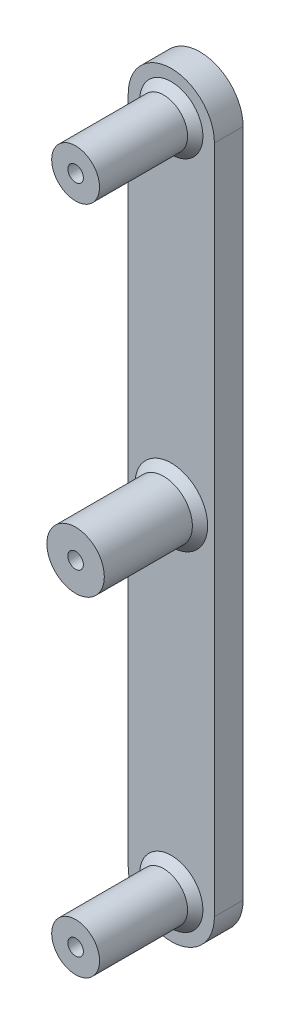
ISO-10303-21;
HEADER;
FILE_DESCRIPTION(('STEP AP214'),'2;1');
FILE_NAME('part.step','',(''),(''),'','','');
FILE_SCHEMA(('AUTOMOTIVE_DESIGN { 1 0 10303 214 1 1 1 1 }'));
ENDSEC;
DATA;
#1=APPLICATION_CONTEXT('core data for automotive mechanical design processes');
#2=APPLICATION_PROTOCOL_DEFINITION('international standard','automotive_design',2000,#1);
#3=PRODUCT_CONTEXT('',#1,'mechanical');
#4=PRODUCT('Part','Part','',(#3));
#5=PRODUCT_RELATED_PRODUCT_CATEGORY('part','',(#4));
#6=PRODUCT_DEFINITION_FORMATION('','',#4);
#7=PRODUCT_DEFINITION_CONTEXT('part definition',#1,'design');
#8=PRODUCT_DEFINITION('design','',#6,#7);
#9=PRODUCT_DEFINITION_SHAPE('','',#8);
#10=(LENGTH_UNIT() NAMED_UNIT(*) SI_UNIT(.MILLI.,.METRE.));
#11=(NAMED_UNIT(*) PLANE_ANGLE_UNIT() SI_UNIT($,.RADIAN.));
#12=(NAMED_UNIT(*) SI_UNIT($,.STERADIAN.) SOLID_ANGLE_UNIT());
#13=UNCERTAINTY_MEASURE_WITH_UNIT(LENGTH_MEASURE(1.E-05),#10,'distance_accuracy_value','');
#14=(GEOMETRIC_REPRESENTATION_CONTEXT(3) GLOBAL_UNCERTAINTY_ASSIGNED_CONTEXT((#13)) GLOBAL_UNIT_ASSIGNED_CONTEXT((#10,
#11,#12)) REPRESENTATION_CONTEXT('',''));
#15=CARTESIAN_POINT('',(0.,0.,0.));
#16=DIRECTION('',(0.,0.,1.));
#17=DIRECTION('',(1.,0.,0.));
#18=AXIS2_PLACEMENT_3D('',#15,#16,#17);
#19=CARTESIAN_POINT('',(0.,-35.,10.));
#20=DIRECTION('',(0.,0.,-1.));
#21=DIRECTION('',(-1.,0.,0.));
#22=AXIS2_PLACEMENT_3D('',#19,#20,#21);
#23=CYLINDRICAL_SURFACE('',#22,2.5);
#24=CARTESIAN_POINT('',(0.,-35.,0.799999999999992));
#25=DIRECTION('',(0.,0.,-1.));
#26=DIRECTION('',(-1.,0.,0.));
#27=AXIS2_PLACEMENT_3D('',#24,#25,#26);
#28=CIRCLE('',#27,2.5);
#29=CARTESIAN_POINT('',(-2.5,-35.,0.799999999999992));
#30=VERTEX_POINT('',#29);
#31=EDGE_CURVE('E140',#30,#30,#28,.F.);
#32=ORIENTED_EDGE('',*,*,#31,.T.);
#33=EDGE_LOOP('',(#32));
#34=FACE_BOUND('',#33,.T.);
#35=CARTESIAN_POINT('',(0.,-35.,10.));
#36=DIRECTION('',(0.,0.,1.));
#37=DIRECTION('',(1.,0.,0.));
#38=AXIS2_PLACEMENT_3D('',#35,#36,#37);
#39=CIRCLE('',#38,2.5);
#40=CARTESIAN_POINT('',(2.5,-35.,10.));
#41=VERTEX_POINT('',#40);
#42=EDGE_CURVE('E124',#41,#41,#39,.T.);
#43=ORIENTED_EDGE('',*,*,#42,.F.);
#44=EDGE_LOOP('',(#43));
#45=FACE_BOUND('',#44,.T.);
#46=ADVANCED_FACE('F45',(#34,#45),#23,.T.);
#47=CARTESIAN_POINT('',(0.,0.,10.));
#48=DIRECTION('',(0.,0.,1.));
#49=DIRECTION('',(1.,0.,0.));
#50=AXIS2_PLACEMENT_3D('',#47,#48,#49);
#51=PLANE('',#50);
#52=CARTESIAN_POINT('',(0.,-35.,10.));
#53=DIRECTION('',(0.,0.,1.));
#54=DIRECTION('',(1.,0.,0.));
#55=AXIS2_PLACEMENT_3D('',#52,#53,#54);
#56=CIRCLE('',#55,0.8125);
#57=CARTESIAN_POINT('',(0.8125,-35.,10.));
#58=VERTEX_POINT('',#57);
#59=EDGE_CURVE('E347',#58,#58,#56,.T.);
#60=ORIENTED_EDGE('',*,*,#59,.F.);
#61=EDGE_LOOP('',(#60));
#62=FACE_BOUND('',#61,.T.);
#63=ORIENTED_EDGE('',*,*,#42,.T.);
#64=EDGE_LOOP('',(#63));
#65=FACE_BOUND('',#64,.T.);
#66=ADVANCED_FACE('F164',(#62,#65),#51,.T.);
#67=CARTESIAN_POINT('',(0.,-35.,-3.));
#68=DIRECTION('',(0.,0.,1.));
#69=DIRECTION('',(1.,0.,0.));
#70=AXIS2_PLACEMENT_3D('',#67,#68,#69);
#71=CYLINDRICAL_SURFACE('',#70,4.49999999999998);
#72=CARTESIAN_POINT('',(0.,-35.,0.));
#73=DIRECTION('',(0.,0.,-1.));
#74=DIRECTION('',(-1.,0.,0.));
#75=AXIS2_PLACEMENT_3D('',#72,#73,#74);
#76=CIRCLE('',#75,4.49999999999998);
#77=CARTESIAN_POINT('',(4.49999999999998,-35.,0.));
#78=VERTEX_POINT('',#77);
#79=CARTESIAN_POINT('',(-4.49999999999998,-35.,0.));
#80=VERTEX_POINT('',#79);
#81=EDGE_CURVE('E114',#78,#80,#76,.T.);
#82=ORIENTED_EDGE('',*,*,#81,.T.);
#83=DIRECTION('',(0.,0.,1.));
#84=VECTOR('',#83,1.);
#85=CARTESIAN_POINT('',(-4.49999999999998,-35.,-3.));
#86=LINE('',#85,#84);
#87=CARTESIAN_POINT('',(-4.49999999999998,-35.,-3.));
#88=VERTEX_POINT('',#87);
#89=EDGE_CURVE('E105',#88,#80,#86,.T.);
#90=ORIENTED_EDGE('',*,*,#89,.F.);
#91=CARTESIAN_POINT('',(0.,-35.,-3.));
#92=DIRECTION('',(0.,0.,-1.));
#93=DIRECTION('',(-1.,0.,0.));
#94=AXIS2_PLACEMENT_3D('',#91,#92,#93);
#95=CIRCLE('',#94,4.49999999999998);
#96=CARTESIAN_POINT('',(4.49999999999998,-35.,-3.));
#97=VERTEX_POINT('',#96);
#98=EDGE_CURVE('E99',#97,#88,#95,.T.);
#99=ORIENTED_EDGE('',*,*,#98,.F.);
#100=DIRECTION('',(0.,0.,1.));
#101=VECTOR('',#100,1.);
#102=CARTESIAN_POINT('',(4.49999999999998,-35.,-3.));
#103=LINE('',#102,#101);
#104=EDGE_CURVE('E110',#97,#78,#103,.T.);
#105=ORIENTED_EDGE('',*,*,#104,.T.);
#106=EDGE_LOOP('',(#82,#90,#99,#105));
#107=FACE_BOUND('',#106,.T.);
#108=ADVANCED_FACE('F172',(#107),#71,.T.);
#109=CARTESIAN_POINT('',(-4.49999999999998,-35.,-3.));
#110=DIRECTION('',(1.,0.,0.));
#111=DIRECTION('',(0.,1.,0.));
#112=AXIS2_PLACEMENT_3D('',#109,#110,#111);
#113=PLANE('',#112);
#114=DIRECTION('',(0.,1.,0.));
#115=VECTOR('',#114,1.);
#116=CARTESIAN_POINT('',(-4.49999999999998,-35.,0.));
#117=LINE('',#116,#115);
#118=CARTESIAN_POINT('',(-4.49999999999999,35.,0.));
#119=VERTEX_POINT('',#118);
#120=EDGE_CURVE('E104',#80,#119,#117,.T.);
#121=ORIENTED_EDGE('',*,*,#120,.T.);
#122=DIRECTION('',(0.,0.,1.));
#123=VECTOR('',#122,1.);
#124=CARTESIAN_POINT('',(-4.49999999999999,35.,-3.));
#125=LINE('',#124,#123);
#126=CARTESIAN_POINT('',(-4.49999999999999,35.,-3.));
#127=VERTEX_POINT('',#126);
#128=EDGE_CURVE('E102',#127,#119,#125,.T.);
#129=ORIENTED_EDGE('',*,*,#128,.F.);
#130=DIRECTION('',(0.,1.,0.));
#131=VECTOR('',#130,1.);
#132=CARTESIAN_POINT('',(-4.49999999999998,-35.,-3.));
#133=LINE('',#132,#131);
#134=EDGE_CURVE('E94',#88,#127,#133,.T.);
#135=ORIENTED_EDGE('',*,*,#134,.F.);
#136=ORIENTED_EDGE('',*,*,#89,.T.);
#137=EDGE_LOOP('',(#121,#129,#135,#136));
#138=FACE_BOUND('',#137,.T.);
#139=ADVANCED_FACE('F103',(#138),#113,.F.);
#140=CARTESIAN_POINT('',(0.,35.,-3.));
#141=DIRECTION('',(0.,0.,1.));
#142=DIRECTION('',(1.,0.,0.));
#143=AXIS2_PLACEMENT_3D('',#140,#141,#142);
#144=CYLINDRICAL_SURFACE('',#143,4.49999999999998);
#145=CARTESIAN_POINT('',(0.,35.,0.));
#146=DIRECTION('',(0.,0.,-1.));
#147=DIRECTION('',(-1.,0.,0.));
#148=AXIS2_PLACEMENT_3D('',#145,#146,#147);
#149=CIRCLE('',#148,4.49999999999998);
#150=CARTESIAN_POINT('',(4.49999999999999,35.,0.));
#151=VERTEX_POINT('',#150);
#152=EDGE_CURVE('E80',#119,#151,#149,.T.);
#153=ORIENTED_EDGE('',*,*,#152,.T.);
#154=DIRECTION('',(0.,0.,1.));
#155=VECTOR('',#154,1.);
#156=CARTESIAN_POINT('',(4.49999999999999,35.,-3.));
#157=LINE('',#156,#155);
#158=CARTESIAN_POINT('',(4.49999999999999,35.,-3.));
#159=VERTEX_POINT('',#158);
#160=EDGE_CURVE('E106',#159,#151,#157,.T.);
#161=ORIENTED_EDGE('',*,*,#160,.F.);
#162=CARTESIAN_POINT('',(0.,35.,-3.));
#163=DIRECTION('',(0.,0.,-1.));
#164=DIRECTION('',(-1.,0.,0.));
#165=AXIS2_PLACEMENT_3D('',#162,#163,#164);
#166=CIRCLE('',#165,4.49999999999998);
#167=EDGE_CURVE('E97',#127,#159,#166,.T.);
#168=ORIENTED_EDGE('',*,*,#167,.F.);
#169=ORIENTED_EDGE('',*,*,#128,.T.);
#170=EDGE_LOOP('',(#153,#161,#168,#169));
#171=FACE_BOUND('',#170,.T.);
#172=ADVANCED_FACE('F108',(#171),#144,.T.);
#173=CARTESIAN_POINT('',(4.49999999999998,-35.,-3.));
#174=DIRECTION('',(-1.,0.,0.));
#175=DIRECTION('',(0.,-1.,0.));
#176=AXIS2_PLACEMENT_3D('',#173,#174,#175);
#177=PLANE('',#176);
#178=DIRECTION('',(0.,-1.,0.));
#179=VECTOR('',#178,1.);
#180=CARTESIAN_POINT('',(4.49999999999998,-35.,0.));
#181=LINE('',#180,#179);
#182=EDGE_CURVE('E86',#151,#78,#181,.T.);
#183=ORIENTED_EDGE('',*,*,#182,.T.);
#184=ORIENTED_EDGE('',*,*,#104,.F.);
#185=DIRECTION('',(0.,-1.,0.));
#186=VECTOR('',#185,1.);
#187=CARTESIAN_POINT('',(4.49999999999998,-35.,-3.));
#188=LINE('',#187,#186);
#189=EDGE_CURVE('E63',#159,#97,#188,.T.);
#190=ORIENTED_EDGE('',*,*,#189,.F.);
#191=ORIENTED_EDGE('',*,*,#160,.T.);
#192=EDGE_LOOP('',(#183,#184,#190,#191));
#193=FACE_BOUND('',#192,.T.);
#194=ADVANCED_FACE('F206',(#193),#177,.F.);
#195=CARTESIAN_POINT('',(0.,-35.,-3.));
#196=DIRECTION('',(0.,0.,-1.));
#197=DIRECTION('',(-1.,0.,0.));
#198=AXIS2_PLACEMENT_3D('',#195,#196,#197);
#199=PLANE('',#198);
#200=CARTESIAN_POINT('',(0.,0.,-3.));
#201=DIRECTION('',(0.,0.,-1.));
#202=DIRECTION('',(-1.,0.,0.));
#203=AXIS2_PLACEMENT_3D('',#200,#201,#202);
#204=CIRCLE('',#203,0.8125);
#205=CARTESIAN_POINT('',(-0.8125,0.,-3.));
#206=VERTEX_POINT('',#205);
#207=EDGE_CURVE('E354',#206,#206,#204,.T.);
#208=ORIENTED_EDGE('',*,*,#207,.F.);
#209=EDGE_LOOP('',(#208));
#210=FACE_BOUND('',#209,.T.);
#211=CARTESIAN_POINT('',(0.,-35.,-3.));
#212=DIRECTION('',(0.,0.,-1.));
#213=DIRECTION('',(-1.,0.,0.));
#214=AXIS2_PLACEMENT_3D('',#211,#212,#213);
#215=CIRCLE('',#214,0.8125);
#216=CARTESIAN_POINT('',(-0.8125,-35.,-3.));
#217=VERTEX_POINT('',#216);
#218=EDGE_CURVE('E128',#217,#217,#215,.T.);
#219=ORIENTED_EDGE('',*,*,#218,.F.);
#220=EDGE_LOOP('',(#219));
#221=FACE_BOUND('',#220,.T.);
#222=CARTESIAN_POINT('',(0.,35.,-3.));
#223=DIRECTION('',(0.,0.,-1.));
#224=DIRECTION('',(-1.,0.,0.));
#225=AXIS2_PLACEMENT_3D('',#222,#223,#224);
#226=CIRCLE('',#225,0.8125);
#227=CARTESIAN_POINT('',(-0.812500000000013,35.,-3.));
#228=VERTEX_POINT('',#227);
#229=EDGE_CURVE('E131',#228,#228,#226,.T.);
#230=ORIENTED_EDGE('',*,*,#229,.F.);
#231=EDGE_LOOP('',(#230));
#232=FACE_BOUND('',#231,.T.);
#233=ORIENTED_EDGE('',*,*,#98,.T.);
#234=ORIENTED_EDGE('',*,*,#134,.T.);
#235=ORIENTED_EDGE('',*,*,#167,.T.);
#236=ORIENTED_EDGE('',*,*,#189,.T.);
#237=EDGE_LOOP('',(#233,#234,#235,#236));
#238=FACE_BOUND('',#237,.T.);
#239=ADVANCED_FACE('F95',(#210,#221,#232,#238),#199,.T.);
#240=CARTESIAN_POINT('',(0.,-35.,0.));
#241=DIRECTION('',(0.,0.,-1.));
#242=DIRECTION('',(-1.,0.,0.));
#243=AXIS2_PLACEMENT_3D('',#240,#241,#242);
#244=PLANE('',#243);
#245=CARTESIAN_POINT('',(0.,0.,0.));
#246=DIRECTION('',(0.,0.,-1.));
#247=DIRECTION('',(-1.,0.,0.));
#248=AXIS2_PLACEMENT_3D('',#245,#246,#247);
#249=CIRCLE('',#248,3.79999999999998);
#250=CARTESIAN_POINT('',(-3.79999999999998,0.,0.));
#251=VERTEX_POINT('',#250);
#252=EDGE_CURVE('E11',#251,#251,#249,.T.);
#253=ORIENTED_EDGE('',*,*,#252,.T.);
#254=EDGE_LOOP('',(#253));
#255=FACE_BOUND('',#254,.T.);
#256=CARTESIAN_POINT('',(0.,35.,0.));
#257=DIRECTION('',(0.,0.,-1.));
#258=DIRECTION('',(-1.,0.,0.));
#259=AXIS2_PLACEMENT_3D('',#256,#257,#258);
#260=CIRCLE('',#259,3.29999999999998);
#261=CARTESIAN_POINT('',(-3.3,35.,0.));
#262=VERTEX_POINT('',#261);
#263=EDGE_CURVE('E137',#262,#262,#260,.T.);
#264=ORIENTED_EDGE('',*,*,#263,.T.);
#265=EDGE_LOOP('',(#264));
#266=FACE_BOUND('',#265,.T.);
#267=CARTESIAN_POINT('',(0.,-35.,0.));
#268=DIRECTION('',(0.,0.,-1.));
#269=DIRECTION('',(-1.,0.,0.));
#270=AXIS2_PLACEMENT_3D('',#267,#268,#269);
#271=CIRCLE('',#270,3.29999999999998);
#272=CARTESIAN_POINT('',(-3.29999999999998,-35.,0.));
#273=VERTEX_POINT('',#272);
#274=EDGE_CURVE('E134',#273,#273,#271,.T.);
#275=ORIENTED_EDGE('',*,*,#274,.T.);
#276=EDGE_LOOP('',(#275));
#277=FACE_BOUND('',#276,.T.);
#278=ORIENTED_EDGE('',*,*,#81,.F.);
#279=ORIENTED_EDGE('',*,*,#182,.F.);
#280=ORIENTED_EDGE('',*,*,#152,.F.);
#281=ORIENTED_EDGE('',*,*,#120,.F.);
#282=EDGE_LOOP('',(#278,#279,#280,#281));
#283=FACE_BOUND('',#282,.T.);
#284=ADVANCED_FACE('F199',(#255,#266,#277,#283),#244,.F.);
#285=CARTESIAN_POINT('',(0.,35.,10.));
#286=DIRECTION('',(0.,0.,-1.));
#287=DIRECTION('',(-1.,0.,0.));
#288=AXIS2_PLACEMENT_3D('',#285,#286,#287);
#289=CYLINDRICAL_SURFACE('',#288,2.5);
#290=CARTESIAN_POINT('',(0.,35.,0.799999999999992));
#291=DIRECTION('',(0.,0.,-1.));
#292=DIRECTION('',(-1.,0.,0.));
#293=AXIS2_PLACEMENT_3D('',#290,#291,#292);
#294=CIRCLE('',#293,2.5);
#295=CARTESIAN_POINT('',(-2.50000000000001,35.,0.799999999999992));
#296=VERTEX_POINT('',#295);
#297=EDGE_CURVE('E127',#296,#296,#294,.F.);
#298=ORIENTED_EDGE('',*,*,#297,.T.);
#299=EDGE_LOOP('',(#298));
#300=FACE_BOUND('',#299,.T.);
#301=CARTESIAN_POINT('',(0.,35.,10.));
#302=DIRECTION('',(0.,0.,1.));
#303=DIRECTION('',(1.,0.,0.));
#304=AXIS2_PLACEMENT_3D('',#301,#302,#303);
#305=CIRCLE('',#304,2.5);
#306=CARTESIAN_POINT('',(2.49999999999999,35.,10.));
#307=VERTEX_POINT('',#306);
#308=EDGE_CURVE('E117',#307,#307,#305,.T.);
#309=ORIENTED_EDGE('',*,*,#308,.F.);
#310=EDGE_LOOP('',(#309));
#311=FACE_BOUND('',#310,.T.);
#312=ADVANCED_FACE('F201',(#300,#311),#289,.T.);
#313=CARTESIAN_POINT('',(0.,0.,10.));
#314=DIRECTION('',(0.,0.,1.));
#315=DIRECTION('',(1.,0.,0.));
#316=AXIS2_PLACEMENT_3D('',#313,#314,#315);
#317=PLANE('',#316);
#318=CARTESIAN_POINT('',(0.,35.,10.));
#319=DIRECTION('',(0.,0.,1.));
#320=DIRECTION('',(1.,0.,0.));
#321=AXIS2_PLACEMENT_3D('',#318,#319,#320);
#322=CIRCLE('',#321,0.8125);
#323=CARTESIAN_POINT('',(0.812499999999987,35.,10.));
#324=VERTEX_POINT('',#323);
#325=EDGE_CURVE('E339',#324,#324,#322,.T.);
#326=ORIENTED_EDGE('',*,*,#325,.F.);
#327=EDGE_LOOP('',(#326));
#328=FACE_BOUND('',#327,.T.);
#329=ORIENTED_EDGE('',*,*,#308,.T.);
#330=EDGE_LOOP('',(#329));
#331=FACE_BOUND('',#330,.T.);
#332=ADVANCED_FACE('F258',(#328,#331),#317,.T.);
#333=CARTESIAN_POINT('',(0.,35.,-10.));
#334=DIRECTION('',(0.,0.,1.));
#335=DIRECTION('',(1.,0.,0.));
#336=AXIS2_PLACEMENT_3D('',#333,#334,#335);
#337=CYLINDRICAL_SURFACE('',#336,0.8125);
#338=ORIENTED_EDGE('',*,*,#229,.T.);
#339=EDGE_LOOP('',(#338));
#340=FACE_BOUND('',#339,.T.);
#341=ORIENTED_EDGE('',*,*,#325,.T.);
#342=EDGE_LOOP('',(#341));
#343=FACE_BOUND('',#342,.T.);
#344=ADVANCED_FACE('F253',(#340,#343),#337,.F.);
#345=CARTESIAN_POINT('',(0.,-35.,-10.));
#346=DIRECTION('',(0.,0.,1.));
#347=DIRECTION('',(1.,0.,0.));
#348=AXIS2_PLACEMENT_3D('',#345,#346,#347);
#349=CYLINDRICAL_SURFACE('',#348,0.8125);
#350=ORIENTED_EDGE('',*,*,#218,.T.);
#351=EDGE_LOOP('',(#350));
#352=FACE_BOUND('',#351,.T.);
#353=ORIENTED_EDGE('',*,*,#59,.T.);
#354=EDGE_LOOP('',(#353));
#355=FACE_BOUND('',#354,.T.);
#356=ADVANCED_FACE('F185',(#352,#355),#349,.F.);
#357=CARTESIAN_POINT('',(0.,35.,0.799999999999992));
#358=DIRECTION('',(0.,0.,-1.));
#359=DIRECTION('',(-1.,0.,0.));
#360=AXIS2_PLACEMENT_3D('',#357,#358,#359);
#361=CONICAL_SURFACE('',#360,2.5,0.785398163397443);
#362=ORIENTED_EDGE('',*,*,#263,.F.);
#363=EDGE_LOOP('',(#362));
#364=FACE_BOUND('',#363,.T.);
#365=ORIENTED_EDGE('',*,*,#297,.F.);
#366=EDGE_LOOP('',(#365));
#367=FACE_BOUND('',#366,.T.);
#368=ADVANCED_FACE('F179',(#364,#367),#361,.T.);
#369=CARTESIAN_POINT('',(0.,-35.,0.799999999999992));
#370=DIRECTION('',(0.,0.,-1.));
#371=DIRECTION('',(-1.,0.,0.));
#372=AXIS2_PLACEMENT_3D('',#369,#370,#371);
#373=CONICAL_SURFACE('',#372,2.5,0.785398163397443);
#374=ORIENTED_EDGE('',*,*,#274,.F.);
#375=EDGE_LOOP('',(#374));
#376=FACE_BOUND('',#375,.T.);
#377=ORIENTED_EDGE('',*,*,#31,.F.);
#378=EDGE_LOOP('',(#377));
#379=FACE_BOUND('',#378,.T.);
#380=ADVANCED_FACE('F184',(#376,#379),#373,.T.);
#381=CARTESIAN_POINT('',(0.,0.,18.4852813742386));
#382=DIRECTION('',(0.,0.,-1.));
#383=DIRECTION('',(-1.,0.,0.));
#384=AXIS2_PLACEMENT_3D('',#381,#382,#383);
#385=CYLINDRICAL_SURFACE('',#384,3.);
#386=CARTESIAN_POINT('',(0.,0.,0.799999999999988));
#387=DIRECTION('',(0.,0.,-1.));
#388=DIRECTION('',(-1.,0.,0.));
#389=AXIS2_PLACEMENT_3D('',#386,#387,#388);
#390=CIRCLE('',#389,3.);
#391=CARTESIAN_POINT('',(-3.,0.,0.799999999999988));
#392=VERTEX_POINT('',#391);
#393=EDGE_CURVE('E55',#392,#392,#390,.F.);
#394=ORIENTED_EDGE('',*,*,#393,.T.);
#395=EDGE_LOOP('',(#394));
#396=FACE_BOUND('',#395,.T.);
#397=CARTESIAN_POINT('',(0.,0.,10.));
#398=DIRECTION('',(0.,0.,1.));
#399=DIRECTION('',(1.,0.,0.));
#400=AXIS2_PLACEMENT_3D('',#397,#398,#399);
#401=CIRCLE('',#400,3.);
#402=CARTESIAN_POINT('',(3.,0.,10.));
#403=VERTEX_POINT('',#402);
#404=EDGE_CURVE('E349',#403,#403,#401,.T.);
#405=ORIENTED_EDGE('',*,*,#404,.F.);
#406=EDGE_LOOP('',(#405));
#407=FACE_BOUND('',#406,.T.);
#408=ADVANCED_FACE('F145',(#396,#407),#385,.T.);
#409=CARTESIAN_POINT('',(0.,0.,10.));
#410=DIRECTION('',(0.,0.,1.));
#411=DIRECTION('',(1.,0.,0.));
#412=AXIS2_PLACEMENT_3D('',#409,#410,#411);
#413=PLANE('',#412);
#414=CARTESIAN_POINT('',(0.,0.,10.));
#415=DIRECTION('',(0.,0.,1.));
#416=DIRECTION('',(1.,0.,0.));
#417=AXIS2_PLACEMENT_3D('',#414,#415,#416);
#418=CIRCLE('',#417,0.8125);
#419=CARTESIAN_POINT('',(0.8125,0.,10.));
#420=VERTEX_POINT('',#419);
#421=EDGE_CURVE('E357',#420,#420,#418,.T.);
#422=ORIENTED_EDGE('',*,*,#421,.F.);
#423=EDGE_LOOP('',(#422));
#424=FACE_BOUND('',#423,.T.);
#425=ORIENTED_EDGE('',*,*,#404,.T.);
#426=EDGE_LOOP('',(#425));
#427=FACE_BOUND('',#426,.T.);
#428=ADVANCED_FACE('F150',(#424,#427),#413,.T.);
#429=CARTESIAN_POINT('',(0.,0.,0.799999999999988));
#430=DIRECTION('',(0.,0.,-1.));
#431=DIRECTION('',(-1.,0.,0.));
#432=AXIS2_PLACEMENT_3D('',#429,#430,#431);
#433=CONICAL_SURFACE('',#432,3.,0.785398163397445);
#434=ORIENTED_EDGE('',*,*,#252,.F.);
#435=EDGE_LOOP('',(#434));
#436=FACE_BOUND('',#435,.T.);
#437=ORIENTED_EDGE('',*,*,#393,.F.);
#438=EDGE_LOOP('',(#437));
#439=FACE_BOUND('',#438,.T.);
#440=ADVANCED_FACE('F48',(#436,#439),#433,.T.);
#441=CARTESIAN_POINT('',(0.,0.,-10.));
#442=DIRECTION('',(0.,0.,1.));
#443=DIRECTION('',(1.,0.,0.));
#444=AXIS2_PLACEMENT_3D('',#441,#442,#443);
#445=CYLINDRICAL_SURFACE('',#444,0.8125);
#446=ORIENTED_EDGE('',*,*,#207,.T.);
#447=EDGE_LOOP('',(#446));
#448=FACE_BOUND('',#447,.T.);
#449=ORIENTED_EDGE('',*,*,#421,.T.);
#450=EDGE_LOOP('',(#449));
#451=FACE_BOUND('',#450,.T.);
#452=ADVANCED_FACE('F149',(#448,#451),#445,.F.);
#453=CLOSED_SHELL('',(#46,#66,#108,#139,#172,#194,#239,#284,#312,#332,#344,#356,#368,#380,#408,
#428,#440,#452));
#454=MANIFOLD_SOLID_BREP('B2',#453);
#455=ADVANCED_BREP_SHAPE_REPRESENTATION('',(#18,#454),#14);
#456=SHAPE_DEFINITION_REPRESENTATION(#9,#455);
ENDSEC;
END-ISO-10303-21;
